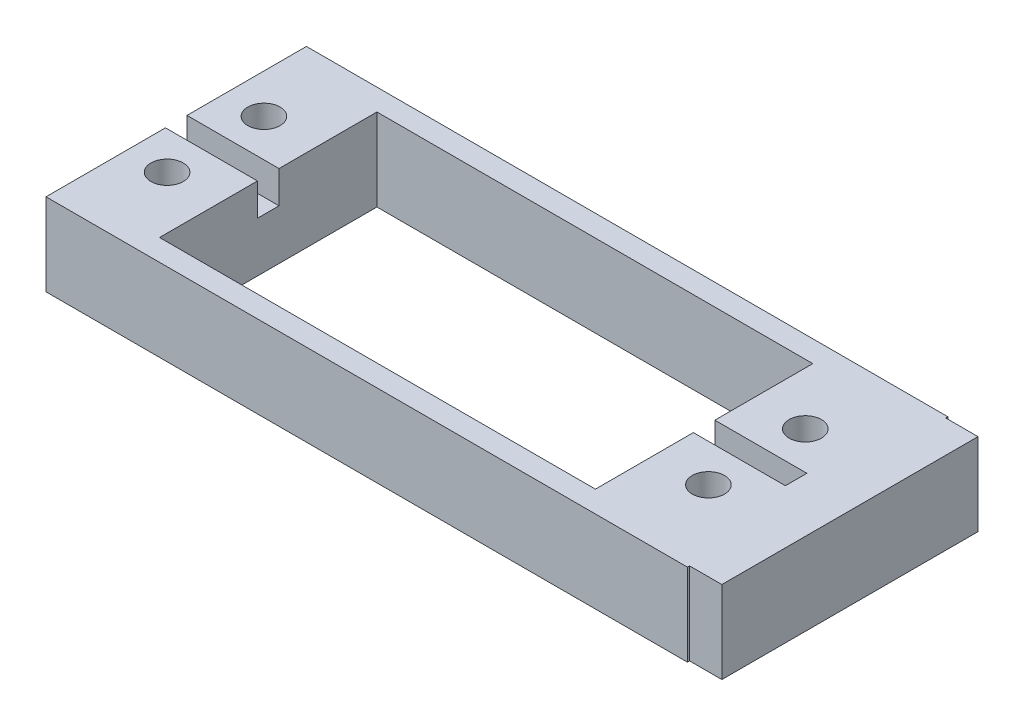
ISO-10303-21;
HEADER;
FILE_DESCRIPTION(('STEP AP214'),'2;1');
FILE_NAME('part.step','',(''),(''),'','','');
FILE_SCHEMA(('AUTOMOTIVE_DESIGN { 1 0 10303 214 1 1 1 1 }'));
ENDSEC;
DATA;
#1=APPLICATION_CONTEXT('core data for automotive mechanical design processes');
#2=APPLICATION_PROTOCOL_DEFINITION('international standard','automotive_design',2000,#1);
#3=PRODUCT_CONTEXT('',#1,'mechanical');
#4=PRODUCT('Part','Part','',(#3));
#5=PRODUCT_RELATED_PRODUCT_CATEGORY('part','',(#4));
#6=PRODUCT_DEFINITION_FORMATION('','',#4);
#7=PRODUCT_DEFINITION_CONTEXT('part definition',#1,'design');
#8=PRODUCT_DEFINITION('design','',#6,#7);
#9=PRODUCT_DEFINITION_SHAPE('','',#8);
#10=(LENGTH_UNIT() NAMED_UNIT(*) SI_UNIT(.MILLI.,.METRE.));
#11=(NAMED_UNIT(*) PLANE_ANGLE_UNIT() SI_UNIT($,.RADIAN.));
#12=(NAMED_UNIT(*) SI_UNIT($,.STERADIAN.) SOLID_ANGLE_UNIT());
#13=UNCERTAINTY_MEASURE_WITH_UNIT(LENGTH_MEASURE(1.E-05),#10,'distance_accuracy_value','');
#14=(GEOMETRIC_REPRESENTATION_CONTEXT(3) GLOBAL_UNCERTAINTY_ASSIGNED_CONTEXT((#13)) GLOBAL_UNIT_ASSIGNED_CONTEXT((#10,
#11,#12)) REPRESENTATION_CONTEXT('',''));
#15=CARTESIAN_POINT('',(0.,0.,0.));
#16=DIRECTION('',(0.,0.,1.));
#17=DIRECTION('',(1.,0.,0.));
#18=AXIS2_PLACEMENT_3D('',#15,#16,#17);
#19=CARTESIAN_POINT('',(-41.2127618521587,0.,0.));
#20=DIRECTION('',(1.,0.,0.));
#21=DIRECTION('',(0.,0.,-1.));
#22=AXIS2_PLACEMENT_3D('',#19,#20,#21);
#23=PLANE('',#22);
#24=DIRECTION('',(0.,1.,0.));
#25=VECTOR('',#24,1.);
#26=CARTESIAN_POINT('',(-41.2127618521587,0.,-3.56654883549664));
#27=LINE('',#26,#25);
#28=CARTESIAN_POINT('',(-41.2127618521587,0.150000000000001,-3.56654883549664));
#29=VERTEX_POINT('',#28);
#30=CARTESIAN_POINT('',(-41.2127618521587,7.8,-3.56654883549664));
#31=VERTEX_POINT('',#30);
#32=EDGE_CURVE('E12',#29,#31,#27,.T.);
#33=ORIENTED_EDGE('',*,*,#32,.F.);
#34=DIRECTION('',(0.,0.,1.));
#35=VECTOR('',#34,1.);
#36=CARTESIAN_POINT('',(-41.2127618521587,0.15,-27.3665488354966));
#37=LINE('',#36,#35);
#38=CARTESIAN_POINT('',(-41.2127618521587,0.15,-27.3665488354966));
#39=VERTEX_POINT('',#38);
#40=EDGE_CURVE('E78',#39,#29,#37,.T.);
#41=ORIENTED_EDGE('',*,*,#40,.F.);
#42=DIRECTION('',(0.,1.,0.));
#43=VECTOR('',#42,1.);
#44=CARTESIAN_POINT('',(-41.2127618521587,0.,-27.3665488354966));
#45=LINE('',#44,#43);
#46=CARTESIAN_POINT('',(-41.2127618521587,7.8,-27.3665488354966));
#47=VERTEX_POINT('',#46);
#48=EDGE_CURVE('E63',#39,#47,#45,.T.);
#49=ORIENTED_EDGE('',*,*,#48,.T.);
#50=DIRECTION('',(0.,0.,1.));
#51=VECTOR('',#50,1.);
#52=CARTESIAN_POINT('',(-41.2127618521587,7.8,-3.36654883549664));
#53=LINE('',#52,#51);
#54=EDGE_CURVE('E240',#47,#31,#53,.T.);
#55=ORIENTED_EDGE('',*,*,#54,.T.);
#56=EDGE_LOOP('',(#33,#41,#49,#55));
#57=FACE_BOUND('',#56,.T.);
#58=ADVANCED_FACE('F54',(#57),#23,.T.);
#59=CARTESIAN_POINT('',(-54.7627618521587,7.8,0.));
#60=DIRECTION('',(1.,0.,0.));
#61=DIRECTION('',(0.,0.,-1.));
#62=AXIS2_PLACEMENT_3D('',#59,#60,#61);
#63=PLANE('',#62);
#64=DIRECTION('',(0.,0.,-1.));
#65=VECTOR('',#64,1.);
#66=CARTESIAN_POINT('',(-54.7627618521587,0.15,0.));
#67=LINE('',#66,#65);
#68=CARTESIAN_POINT('',(-54.7627618521587,0.15,-5.36654883549664));
#69=VERTEX_POINT('',#68);
#70=CARTESIAN_POINT('',(-54.7627618521587,0.15,-25.5665488354966));
#71=VERTEX_POINT('',#70);
#72=EDGE_CURVE('E421',#69,#71,#67,.T.);
#73=ORIENTED_EDGE('',*,*,#72,.F.);
#74=DIRECTION('',(0.,1.,0.));
#75=VECTOR('',#74,1.);
#76=CARTESIAN_POINT('',(-54.7627618521587,0.,-5.36654883549664));
#77=LINE('',#76,#75);
#78=CARTESIAN_POINT('',(-54.7627618521587,7.8,-5.36654883549664));
#79=VERTEX_POINT('',#78);
#80=EDGE_CURVE('E364',#69,#79,#77,.T.);
#81=ORIENTED_EDGE('',*,*,#80,.T.);
#82=DIRECTION('',(0.,0.,1.));
#83=VECTOR('',#82,1.);
#84=CARTESIAN_POINT('',(-54.7627618521587,7.8,0.));
#85=LINE('',#84,#83);
#86=CARTESIAN_POINT('',(-54.7627618521587,7.8,-14.4665488354966));
#87=VERTEX_POINT('',#86);
#88=EDGE_CURVE('E378',#87,#79,#85,.T.);
#89=ORIENTED_EDGE('',*,*,#88,.F.);
#90=DIRECTION('',(0.,1.,0.));
#91=VECTOR('',#90,1.);
#92=CARTESIAN_POINT('',(-54.7627618521587,4.8,-14.4665488354966));
#93=LINE('',#92,#91);
#94=CARTESIAN_POINT('',(-54.7627618521587,4.8,-14.4665488354966));
#95=VERTEX_POINT('',#94);
#96=EDGE_CURVE('E301',#95,#87,#93,.T.);
#97=ORIENTED_EDGE('',*,*,#96,.F.);
#98=DIRECTION('',(0.,0.,1.));
#99=VECTOR('',#98,1.);
#100=CARTESIAN_POINT('',(-54.7627618521587,4.8,0.));
#101=LINE('',#100,#99);
#102=CARTESIAN_POINT('',(-54.7627618521587,4.8,-16.4665488354966));
#103=VERTEX_POINT('',#102);
#104=EDGE_CURVE('E286',#103,#95,#101,.T.);
#105=ORIENTED_EDGE('',*,*,#104,.F.);
#106=DIRECTION('',(0.,1.,0.));
#107=VECTOR('',#106,1.);
#108=CARTESIAN_POINT('',(-54.7627618521587,4.8,-16.4665488354966));
#109=LINE('',#108,#107);
#110=CARTESIAN_POINT('',(-54.7627618521587,7.8,-16.4665488354966));
#111=VERTEX_POINT('',#110);
#112=EDGE_CURVE('E268',#103,#111,#109,.T.);
#113=ORIENTED_EDGE('',*,*,#112,.T.);
#114=CARTESIAN_POINT('',(-54.7627618521587,7.8,-25.5665488354966));
#115=VERTEX_POINT('',#114);
#116=EDGE_CURVE('E379',#115,#111,#85,.T.);
#117=ORIENTED_EDGE('',*,*,#116,.F.);
#118=DIRECTION('',(0.,1.,0.));
#119=VECTOR('',#118,1.);
#120=CARTESIAN_POINT('',(-54.7627618521587,0.,-25.5665488354966));
#121=LINE('',#120,#119);
#122=EDGE_CURVE('E367',#71,#115,#121,.T.);
#123=ORIENTED_EDGE('',*,*,#122,.F.);
#124=EDGE_LOOP('',(#73,#81,#89,#97,#105,#113,#117,#123));
#125=FACE_BOUND('',#124,.T.);
#126=ADVANCED_FACE('F472',(#125),#63,.F.);
#127=CARTESIAN_POINT('',(-103.812761852159,0.,-25.5665488354966));
#128=DIRECTION('',(-1.,0.,0.));
#129=DIRECTION('',(0.,0.,1.));
#130=AXIS2_PLACEMENT_3D('',#127,#128,#129);
#131=PLANE('',#130);
#132=DIRECTION('',(0.,1.,0.));
#133=VECTOR('',#132,1.);
#134=CARTESIAN_POINT('',(-103.812761852159,0.,-27.5665488354966));
#135=LINE('',#134,#133);
#136=CARTESIAN_POINT('',(-103.812761852159,0.15,-27.5665488354966));
#137=VERTEX_POINT('',#136);
#138=CARTESIAN_POINT('',(-103.812761852159,7.8,-27.5665488354966));
#139=VERTEX_POINT('',#138);
#140=EDGE_CURVE('E361',#137,#139,#135,.T.);
#141=ORIENTED_EDGE('',*,*,#140,.F.);
#142=DIRECTION('',(0.,0.,-1.));
#143=VECTOR('',#142,1.);
#144=CARTESIAN_POINT('',(-103.812761852159,0.15,-3.36654883549664));
#145=LINE('',#144,#143);
#146=CARTESIAN_POINT('',(-103.812761852159,0.15,-3.36654883549664));
#147=VERTEX_POINT('',#146);
#148=EDGE_CURVE('E402',#147,#137,#145,.T.);
#149=ORIENTED_EDGE('',*,*,#148,.F.);
#150=DIRECTION('',(0.,1.,0.));
#151=VECTOR('',#150,1.);
#152=CARTESIAN_POINT('',(-103.812761852159,0.,-3.36654883549664));
#153=LINE('',#152,#151);
#154=CARTESIAN_POINT('',(-103.812761852159,7.8,-3.36654883549664));
#155=VERTEX_POINT('',#154);
#156=EDGE_CURVE('E276',#147,#155,#153,.T.);
#157=ORIENTED_EDGE('',*,*,#156,.T.);
#158=DIRECTION('',(0.,0.,1.));
#159=VECTOR('',#158,1.);
#160=CARTESIAN_POINT('',(-103.812761852159,7.8,-25.5665488354966));
#161=LINE('',#160,#159);
#162=CARTESIAN_POINT('',(-103.812761852159,7.8,-14.4665488354966));
#163=VERTEX_POINT('',#162);
#164=EDGE_CURVE('E348',#163,#155,#161,.T.);
#165=ORIENTED_EDGE('',*,*,#164,.F.);
#166=DIRECTION('',(0.,1.,0.));
#167=VECTOR('',#166,1.);
#168=CARTESIAN_POINT('',(-103.812761852159,4.8,-14.4665488354966));
#169=LINE('',#168,#167);
#170=CARTESIAN_POINT('',(-103.812761852159,4.8,-14.4665488354966));
#171=VERTEX_POINT('',#170);
#172=EDGE_CURVE('E277',#171,#163,#169,.T.);
#173=ORIENTED_EDGE('',*,*,#172,.F.);
#174=DIRECTION('',(0.,0.,1.));
#175=VECTOR('',#174,1.);
#176=CARTESIAN_POINT('',(-103.812761852159,4.8,0.));
#177=LINE('',#176,#175);
#178=CARTESIAN_POINT('',(-103.812761852159,4.8,-16.4665488354966));
#179=VERTEX_POINT('',#178);
#180=EDGE_CURVE('E257',#179,#171,#177,.T.);
#181=ORIENTED_EDGE('',*,*,#180,.F.);
#182=DIRECTION('',(0.,1.,0.));
#183=VECTOR('',#182,1.);
#184=CARTESIAN_POINT('',(-103.812761852159,4.8,-16.4665488354966));
#185=LINE('',#184,#183);
#186=CARTESIAN_POINT('',(-103.812761852159,7.8,-16.4665488354966));
#187=VERTEX_POINT('',#186);
#188=EDGE_CURVE('E280',#179,#187,#185,.T.);
#189=ORIENTED_EDGE('',*,*,#188,.T.);
#190=EDGE_CURVE('E349',#139,#187,#161,.T.);
#191=ORIENTED_EDGE('',*,*,#190,.F.);
#192=EDGE_LOOP('',(#141,#149,#157,#165,#173,#181,#189,#191));
#193=FACE_BOUND('',#192,.T.);
#194=ADVANCED_FACE('F478',(#193),#131,.T.);
#195=CARTESIAN_POINT('',(-95.2627618521587,7.8,0.));
#196=DIRECTION('',(1.,0.,0.));
#197=DIRECTION('',(0.,0.,-1.));
#198=AXIS2_PLACEMENT_3D('',#195,#196,#197);
#199=PLANE('',#198);
#200=DIRECTION('',(0.,1.,0.));
#201=VECTOR('',#200,1.);
#202=CARTESIAN_POINT('',(-95.2627618521587,0.,-5.36654883549664));
#203=LINE('',#202,#201);
#204=CARTESIAN_POINT('',(-95.2627618521587,0.15,-5.36654883549664));
#205=VERTEX_POINT('',#204);
#206=CARTESIAN_POINT('',(-95.2627618521587,7.8,-5.36654883549664));
#207=VERTEX_POINT('',#206);
#208=EDGE_CURVE('E332',#205,#207,#203,.T.);
#209=ORIENTED_EDGE('',*,*,#208,.F.);
#210=DIRECTION('',(0.,0.,-1.));
#211=VECTOR('',#210,1.);
#212=CARTESIAN_POINT('',(-95.2627618521587,0.15,0.));
#213=LINE('',#212,#211);
#214=CARTESIAN_POINT('',(-95.2627618521587,0.15,-25.5665488354966));
#215=VERTEX_POINT('',#214);
#216=EDGE_CURVE('E70',#205,#215,#213,.T.);
#217=ORIENTED_EDGE('',*,*,#216,.T.);
#218=DIRECTION('',(0.,1.,0.));
#219=VECTOR('',#218,1.);
#220=CARTESIAN_POINT('',(-95.2627618521587,0.,-25.5665488354966));
#221=LINE('',#220,#219);
#222=CARTESIAN_POINT('',(-95.2627618521587,7.8,-25.5665488354966));
#223=VERTEX_POINT('',#222);
#224=EDGE_CURVE('E329',#215,#223,#221,.T.);
#225=ORIENTED_EDGE('',*,*,#224,.T.);
#226=DIRECTION('',(0.,0.,1.));
#227=VECTOR('',#226,1.);
#228=CARTESIAN_POINT('',(-95.2627618521587,7.8,0.));
#229=LINE('',#228,#227);
#230=CARTESIAN_POINT('',(-95.2627618521587,7.8,-16.4665488354966));
#231=VERTEX_POINT('',#230);
#232=EDGE_CURVE('E344',#223,#231,#229,.T.);
#233=ORIENTED_EDGE('',*,*,#232,.T.);
#234=DIRECTION('',(0.,1.,0.));
#235=VECTOR('',#234,1.);
#236=CARTESIAN_POINT('',(-95.2627618521587,4.8,-16.4665488354966));
#237=LINE('',#236,#235);
#238=CARTESIAN_POINT('',(-95.2627618521587,4.8,-16.4665488354966));
#239=VERTEX_POINT('',#238);
#240=EDGE_CURVE('E264',#239,#231,#237,.T.);
#241=ORIENTED_EDGE('',*,*,#240,.F.);
#242=DIRECTION('',(0.,0.,-1.));
#243=VECTOR('',#242,1.);
#244=CARTESIAN_POINT('',(-95.2627618521587,4.8,0.));
#245=LINE('',#244,#243);
#246=CARTESIAN_POINT('',(-95.2627618521587,4.8,-14.4665488354966));
#247=VERTEX_POINT('',#246);
#248=EDGE_CURVE('E248',#247,#239,#245,.T.);
#249=ORIENTED_EDGE('',*,*,#248,.F.);
#250=DIRECTION('',(0.,1.,0.));
#251=VECTOR('',#250,1.);
#252=CARTESIAN_POINT('',(-95.2627618521587,4.8,-14.4665488354966));
#253=LINE('',#252,#251);
#254=CARTESIAN_POINT('',(-95.2627618521587,7.8,-14.4665488354966));
#255=VERTEX_POINT('',#254);
#256=EDGE_CURVE('E272',#247,#255,#253,.T.);
#257=ORIENTED_EDGE('',*,*,#256,.T.);
#258=EDGE_CURVE('E343',#255,#207,#229,.T.);
#259=ORIENTED_EDGE('',*,*,#258,.T.);
#260=EDGE_LOOP('',(#209,#217,#225,#233,#241,#249,#257,#259));
#261=FACE_BOUND('',#260,.T.);
#262=ADVANCED_FACE('F513',(#261),#199,.T.);
#263=CARTESIAN_POINT('',(-49.8627618521587,7.8,-19.9665488354966));
#264=DIRECTION('',(0.,-1.,0.));
#265=DIRECTION('',(0.,0.,-1.));
#266=AXIS2_PLACEMENT_3D('',#263,#264,#265);
#267=CYLINDRICAL_SURFACE('',#266,1.5);
#268=CARTESIAN_POINT('',(-49.8627618521587,7.8,-19.9665488354966));
#269=DIRECTION('',(0.,1.,0.));
#270=DIRECTION('',(0.,0.,1.));
#271=AXIS2_PLACEMENT_3D('',#268,#269,#270);
#272=CIRCLE('',#271,1.5);
#273=CARTESIAN_POINT('',(-49.8627618521587,7.8,-18.4665488354966));
#274=VERTEX_POINT('',#273);
#275=EDGE_CURVE('E374',#274,#274,#272,.T.);
#276=ORIENTED_EDGE('',*,*,#275,.T.);
#277=EDGE_LOOP('',(#276));
#278=FACE_BOUND('',#277,.T.);
#279=CARTESIAN_POINT('',(-49.8627618521587,0.15,-19.9665488354966));
#280=DIRECTION('',(0.,-1.,0.));
#281=DIRECTION('',(0.,0.,-1.));
#282=AXIS2_PLACEMENT_3D('',#279,#280,#281);
#283=CIRCLE('',#282,1.5);
#284=CARTESIAN_POINT('',(-49.8627618521587,0.15,-21.4665488354966));
#285=VERTEX_POINT('',#284);
#286=EDGE_CURVE('E227',#285,#285,#283,.T.);
#287=ORIENTED_EDGE('',*,*,#286,.T.);
#288=EDGE_LOOP('',(#287));
#289=FACE_BOUND('',#288,.T.);
#290=ADVANCED_FACE('F443',(#278,#289),#267,.F.);
#291=CARTESIAN_POINT('',(-49.8627618521587,7.8,-10.9665488354966));
#292=DIRECTION('',(0.,-1.,0.));
#293=DIRECTION('',(0.,0.,-1.));
#294=AXIS2_PLACEMENT_3D('',#291,#292,#293);
#295=CYLINDRICAL_SURFACE('',#294,1.5);
#296=CARTESIAN_POINT('',(-49.8627618521587,7.8,-10.9665488354966));
#297=DIRECTION('',(0.,1.,0.));
#298=DIRECTION('',(0.,0.,1.));
#299=AXIS2_PLACEMENT_3D('',#296,#297,#298);
#300=CIRCLE('',#299,1.5);
#301=CARTESIAN_POINT('',(-49.8627618521587,7.8,-9.46654883549664));
#302=VERTEX_POINT('',#301);
#303=EDGE_CURVE('E370',#302,#302,#300,.T.);
#304=ORIENTED_EDGE('',*,*,#303,.T.);
#305=EDGE_LOOP('',(#304));
#306=FACE_BOUND('',#305,.T.);
#307=CARTESIAN_POINT('',(-49.8627618521587,0.15,-10.9665488354966));
#308=DIRECTION('',(0.,-1.,0.));
#309=DIRECTION('',(0.,0.,-1.));
#310=AXIS2_PLACEMENT_3D('',#307,#308,#309);
#311=CIRCLE('',#310,1.5);
#312=CARTESIAN_POINT('',(-49.8627618521587,0.15,-12.4665488354967));
#313=VERTEX_POINT('',#312);
#314=EDGE_CURVE('E436',#313,#313,#311,.T.);
#315=ORIENTED_EDGE('',*,*,#314,.T.);
#316=EDGE_LOOP('',(#315));
#317=FACE_BOUND('',#316,.T.);
#318=ADVANCED_FACE('F56',(#306,#317),#295,.F.);
#319=CARTESIAN_POINT('',(-103.812761852159,0.,-27.5665488354966));
#320=DIRECTION('',(0.,0.,-1.));
#321=DIRECTION('',(-1.,0.,0.));
#322=AXIS2_PLACEMENT_3D('',#319,#320,#321);
#323=PLANE('',#322);
#324=DIRECTION('',(0.,-1.,0.));
#325=VECTOR('',#324,1.);
#326=CARTESIAN_POINT('',(-44.2127618521587,13.8,-27.5665488354966));
#327=LINE('',#326,#325);
#328=CARTESIAN_POINT('',(-44.2127618521587,7.8,-27.5665488354966));
#329=VERTEX_POINT('',#328);
#330=CARTESIAN_POINT('',(-44.2127618521587,0.15,-27.5665488354966));
#331=VERTEX_POINT('',#330);
#332=EDGE_CURVE('E213',#329,#331,#327,.T.);
#333=ORIENTED_EDGE('',*,*,#332,.T.);
#334=DIRECTION('',(1.,0.,0.));
#335=VECTOR('',#334,1.);
#336=CARTESIAN_POINT('',(-103.812761852159,0.15,-27.5665488354966));
#337=LINE('',#336,#335);
#338=EDGE_CURVE('E405',#137,#331,#337,.T.);
#339=ORIENTED_EDGE('',*,*,#338,.F.);
#340=ORIENTED_EDGE('',*,*,#140,.T.);
#341=DIRECTION('',(-1.,0.,0.));
#342=VECTOR('',#341,1.);
#343=CARTESIAN_POINT('',(-103.812761852159,7.8,-27.5665488354966));
#344=LINE('',#343,#342);
#345=EDGE_CURVE('E357',#329,#139,#344,.T.);
#346=ORIENTED_EDGE('',*,*,#345,.F.);
#347=EDGE_LOOP('',(#333,#339,#340,#346));
#348=FACE_BOUND('',#347,.T.);
#349=ADVANCED_FACE('F560',(#348),#323,.T.);
#350=CARTESIAN_POINT('',(-103.812761852159,0.,-25.5665488354966));
#351=DIRECTION('',(0.,0.,1.));
#352=DIRECTION('',(1.,0.,0.));
#353=AXIS2_PLACEMENT_3D('',#350,#351,#352);
#354=PLANE('',#353);
#355=ORIENTED_EDGE('',*,*,#224,.F.);
#356=DIRECTION('',(1.,0.,0.));
#357=VECTOR('',#356,1.);
#358=CARTESIAN_POINT('',(-103.812761852159,0.15,-25.5665488354966));
#359=LINE('',#358,#357);
#360=EDGE_CURVE('E424',#215,#71,#359,.T.);
#361=ORIENTED_EDGE('',*,*,#360,.T.);
#362=ORIENTED_EDGE('',*,*,#122,.T.);
#363=DIRECTION('',(1.,0.,0.));
#364=VECTOR('',#363,1.);
#365=CARTESIAN_POINT('',(-103.812761852159,7.8,-25.5665488354966));
#366=LINE('',#365,#364);
#367=EDGE_CURVE('E353',#223,#115,#366,.T.);
#368=ORIENTED_EDGE('',*,*,#367,.F.);
#369=EDGE_LOOP('',(#355,#361,#362,#368));
#370=FACE_BOUND('',#369,.T.);
#371=ADVANCED_FACE('F467',(#370),#354,.T.);
#372=CARTESIAN_POINT('',(-100.162761852159,7.8,-19.9665488354966));
#373=DIRECTION('',(0.,-1.,0.));
#374=DIRECTION('',(0.,0.,-1.));
#375=AXIS2_PLACEMENT_3D('',#372,#373,#374);
#376=CYLINDRICAL_SURFACE('',#375,1.5);
#377=CARTESIAN_POINT('',(-100.162761852159,7.8,-19.9665488354966));
#378=DIRECTION('',(0.,1.,0.));
#379=DIRECTION('',(0.,0.,1.));
#380=AXIS2_PLACEMENT_3D('',#377,#378,#379);
#381=CIRCLE('',#380,1.5);
#382=CARTESIAN_POINT('',(-100.162761852159,7.8,-18.4665488354966));
#383=VERTEX_POINT('',#382);
#384=EDGE_CURVE('E339',#383,#383,#381,.T.);
#385=ORIENTED_EDGE('',*,*,#384,.T.);
#386=EDGE_LOOP('',(#385));
#387=FACE_BOUND('',#386,.T.);
#388=CARTESIAN_POINT('',(-100.162761852159,0.15,-19.9665488354966));
#389=DIRECTION('',(0.,-1.,0.));
#390=DIRECTION('',(0.,0.,-1.));
#391=AXIS2_PLACEMENT_3D('',#388,#389,#390);
#392=CIRCLE('',#391,1.5);
#393=CARTESIAN_POINT('',(-100.162761852159,0.15,-21.4665488354966));
#394=VERTEX_POINT('',#393);
#395=EDGE_CURVE('E432',#394,#394,#392,.T.);
#396=ORIENTED_EDGE('',*,*,#395,.T.);
#397=EDGE_LOOP('',(#396));
#398=FACE_BOUND('',#397,.T.);
#399=ADVANCED_FACE('F458',(#387,#398),#376,.F.);
#400=CARTESIAN_POINT('',(-100.162761852159,7.8,-10.9665488354966));
#401=DIRECTION('',(0.,-1.,0.));
#402=DIRECTION('',(0.,0.,-1.));
#403=AXIS2_PLACEMENT_3D('',#400,#401,#402);
#404=CYLINDRICAL_SURFACE('',#403,1.5);
#405=CARTESIAN_POINT('',(-100.162761852159,7.8,-10.9665488354966));
#406=DIRECTION('',(0.,1.,0.));
#407=DIRECTION('',(0.,0.,1.));
#408=AXIS2_PLACEMENT_3D('',#405,#406,#407);
#409=CIRCLE('',#408,1.5);
#410=CARTESIAN_POINT('',(-100.162761852159,7.8,-9.46654883549665));
#411=VERTEX_POINT('',#410);
#412=EDGE_CURVE('E335',#411,#411,#409,.T.);
#413=ORIENTED_EDGE('',*,*,#412,.T.);
#414=EDGE_LOOP('',(#413));
#415=FACE_BOUND('',#414,.T.);
#416=CARTESIAN_POINT('',(-100.162761852159,0.15,-10.9665488354966));
#417=DIRECTION('',(0.,-1.,0.));
#418=DIRECTION('',(0.,0.,-1.));
#419=AXIS2_PLACEMENT_3D('',#416,#417,#418);
#420=CIRCLE('',#419,1.5);
#421=CARTESIAN_POINT('',(-100.162761852159,0.15,-12.4665488354966));
#422=VERTEX_POINT('',#421);
#423=EDGE_CURVE('E428',#422,#422,#420,.T.);
#424=ORIENTED_EDGE('',*,*,#423,.T.);
#425=EDGE_LOOP('',(#424));
#426=FACE_BOUND('',#425,.T.);
#427=ADVANCED_FACE('F455',(#415,#426),#404,.F.);
#428=CARTESIAN_POINT('',(-103.812761852159,0.,-5.36654883549664));
#429=DIRECTION('',(0.,0.,-1.));
#430=DIRECTION('',(-1.,0.,0.));
#431=AXIS2_PLACEMENT_3D('',#428,#429,#430);
#432=PLANE('',#431);
#433=ORIENTED_EDGE('',*,*,#80,.F.);
#434=DIRECTION('',(-1.,0.,0.));
#435=VECTOR('',#434,1.);
#436=CARTESIAN_POINT('',(-103.812761852159,0.15,-5.36654883549664));
#437=LINE('',#436,#435);
#438=EDGE_CURVE('E416',#69,#205,#437,.T.);
#439=ORIENTED_EDGE('',*,*,#438,.T.);
#440=ORIENTED_EDGE('',*,*,#208,.T.);
#441=DIRECTION('',(-1.,0.,0.));
#442=VECTOR('',#441,1.);
#443=CARTESIAN_POINT('',(-103.812761852159,7.8,-5.36654883549664));
#444=LINE('',#443,#442);
#445=EDGE_CURVE('E321',#79,#207,#444,.T.);
#446=ORIENTED_EDGE('',*,*,#445,.F.);
#447=EDGE_LOOP('',(#433,#439,#440,#446));
#448=FACE_BOUND('',#447,.T.);
#449=ADVANCED_FACE('F457',(#448),#432,.T.);
#450=CARTESIAN_POINT('',(-103.812761852159,0.,-3.36654883549664));
#451=DIRECTION('',(0.,0.,1.));
#452=DIRECTION('',(1.,0.,0.));
#453=AXIS2_PLACEMENT_3D('',#450,#451,#452);
#454=PLANE('',#453);
#455=ORIENTED_EDGE('',*,*,#156,.F.);
#456=DIRECTION('',(-1.,0.,0.));
#457=VECTOR('',#456,1.);
#458=CARTESIAN_POINT('',(-44.2127618521587,0.15,-3.36654883549664));
#459=LINE('',#458,#457);
#460=CARTESIAN_POINT('',(-44.2127618521587,0.15,-3.36654883549664));
#461=VERTEX_POINT('',#460);
#462=EDGE_CURVE('E207',#461,#147,#459,.T.);
#463=ORIENTED_EDGE('',*,*,#462,.F.);
#464=DIRECTION('',(0.,-1.,0.));
#465=VECTOR('',#464,1.);
#466=CARTESIAN_POINT('',(-44.2127618521587,13.8,-3.36654883549664));
#467=LINE('',#466,#465);
#468=CARTESIAN_POINT('',(-44.2127618521587,7.8,-3.36654883549664));
#469=VERTEX_POINT('',#468);
#470=EDGE_CURVE('E205',#469,#461,#467,.T.);
#471=ORIENTED_EDGE('',*,*,#470,.F.);
#472=DIRECTION('',(1.,0.,0.));
#473=VECTOR('',#472,1.);
#474=CARTESIAN_POINT('',(-103.812761852159,7.8,-3.36654883549664));
#475=LINE('',#474,#473);
#476=EDGE_CURVE('E325',#155,#469,#475,.T.);
#477=ORIENTED_EDGE('',*,*,#476,.F.);
#478=EDGE_LOOP('',(#455,#463,#471,#477));
#479=FACE_BOUND('',#478,.T.);
#480=ADVANCED_FACE('F399',(#479),#454,.T.);
#481=CARTESIAN_POINT('',(0.,13.8,-27.3665488354966));
#482=DIRECTION('',(0.,0.,-1.));
#483=DIRECTION('',(-1.,0.,0.));
#484=AXIS2_PLACEMENT_3D('',#481,#482,#483);
#485=PLANE('',#484);
#486=ORIENTED_EDGE('',*,*,#48,.F.);
#487=DIRECTION('',(1.,0.,0.));
#488=VECTOR('',#487,1.);
#489=CARTESIAN_POINT('',(-44.2127618521587,0.15,-27.3665488354966));
#490=LINE('',#489,#488);
#491=CARTESIAN_POINT('',(-44.2127618521587,0.15,-27.3665488354966));
#492=VERTEX_POINT('',#491);
#493=EDGE_CURVE('E413',#492,#39,#490,.T.);
#494=ORIENTED_EDGE('',*,*,#493,.F.);
#495=DIRECTION('',(0.,-1.,0.));
#496=VECTOR('',#495,1.);
#497=CARTESIAN_POINT('',(-44.2127618521587,13.8,-27.3665488354966));
#498=LINE('',#497,#496);
#499=CARTESIAN_POINT('',(-44.2127618521587,7.8,-27.3665488354966));
#500=VERTEX_POINT('',#499);
#501=EDGE_CURVE('E220',#500,#492,#498,.T.);
#502=ORIENTED_EDGE('',*,*,#501,.F.);
#503=DIRECTION('',(-1.,0.,0.));
#504=VECTOR('',#503,1.);
#505=CARTESIAN_POINT('',(0.,7.8,-27.3665488354966));
#506=LINE('',#505,#504);
#507=EDGE_CURVE('E217',#47,#500,#506,.T.);
#508=ORIENTED_EDGE('',*,*,#507,.F.);
#509=EDGE_LOOP('',(#486,#494,#502,#508));
#510=FACE_BOUND('',#509,.T.);
#511=ADVANCED_FACE('F390',(#510),#485,.T.);
#512=CARTESIAN_POINT('',(-44.2127618521587,13.8,0.));
#513=DIRECTION('',(-1.,0.,0.));
#514=DIRECTION('',(0.,0.,1.));
#515=AXIS2_PLACEMENT_3D('',#512,#513,#514);
#516=PLANE('',#515);
#517=DIRECTION('',(0.,0.,1.));
#518=VECTOR('',#517,1.);
#519=CARTESIAN_POINT('',(-44.2127618521587,0.15,-27.5665488354966));
#520=LINE('',#519,#518);
#521=EDGE_CURVE('E410',#331,#492,#520,.T.);
#522=ORIENTED_EDGE('',*,*,#521,.F.);
#523=ORIENTED_EDGE('',*,*,#332,.F.);
#524=DIRECTION('',(0.,0.,1.));
#525=VECTOR('',#524,1.);
#526=CARTESIAN_POINT('',(-44.2127618521587,7.8,0.));
#527=LINE('',#526,#525);
#528=EDGE_CURVE('E236',#329,#500,#527,.T.);
#529=ORIENTED_EDGE('',*,*,#528,.T.);
#530=ORIENTED_EDGE('',*,*,#501,.T.);
#531=EDGE_LOOP('',(#522,#523,#529,#530));
#532=FACE_BOUND('',#531,.T.);
#533=ADVANCED_FACE('F563',(#532),#516,.F.);
#534=CARTESIAN_POINT('',(-44.2127618521587,13.8,0.));
#535=DIRECTION('',(-1.,0.,0.));
#536=DIRECTION('',(0.,0.,1.));
#537=AXIS2_PLACEMENT_3D('',#534,#535,#536);
#538=PLANE('',#537);
#539=DIRECTION('',(0.,0.,1.));
#540=VECTOR('',#539,1.);
#541=CARTESIAN_POINT('',(-44.2127618521587,0.15,-3.56654883549664));
#542=LINE('',#541,#540);
#543=CARTESIAN_POINT('',(-44.2127618521587,0.15,-3.56654883549664));
#544=VERTEX_POINT('',#543);
#545=EDGE_CURVE('E191',#544,#461,#542,.T.);
#546=ORIENTED_EDGE('',*,*,#545,.F.);
#547=DIRECTION('',(0.,-1.,0.));
#548=VECTOR('',#547,1.);
#549=CARTESIAN_POINT('',(-44.2127618521587,13.8,-3.56654883549664));
#550=LINE('',#549,#548);
#551=CARTESIAN_POINT('',(-44.2127618521587,7.8,-3.56654883549664));
#552=VERTEX_POINT('',#551);
#553=EDGE_CURVE('E202',#552,#544,#550,.T.);
#554=ORIENTED_EDGE('',*,*,#553,.F.);
#555=DIRECTION('',(0.,0.,1.));
#556=VECTOR('',#555,1.);
#557=CARTESIAN_POINT('',(-44.2127618521587,7.8,0.));
#558=LINE('',#557,#556);
#559=EDGE_CURVE('E233',#552,#469,#558,.T.);
#560=ORIENTED_EDGE('',*,*,#559,.T.);
#561=ORIENTED_EDGE('',*,*,#470,.T.);
#562=EDGE_LOOP('',(#546,#554,#560,#561));
#563=FACE_BOUND('',#562,.T.);
#564=ADVANCED_FACE('F201',(#563),#538,.F.);
#565=CARTESIAN_POINT('',(0.,13.8,-3.56654883549664));
#566=DIRECTION('',(0.,0.,-1.));
#567=DIRECTION('',(-1.,0.,0.));
#568=AXIS2_PLACEMENT_3D('',#565,#566,#567);
#569=PLANE('',#568);
#570=DIRECTION('',(-1.,0.,0.));
#571=VECTOR('',#570,1.);
#572=CARTESIAN_POINT('',(-41.2127618521587,0.15,-3.56654883549664));
#573=LINE('',#572,#571);
#574=EDGE_CURVE('E188',#29,#544,#573,.T.);
#575=ORIENTED_EDGE('',*,*,#574,.F.);
#576=ORIENTED_EDGE('',*,*,#32,.T.);
#577=DIRECTION('',(-1.,0.,0.));
#578=VECTOR('',#577,1.);
#579=CARTESIAN_POINT('',(0.,7.8,-3.56654883549664));
#580=LINE('',#579,#578);
#581=EDGE_CURVE('E211',#31,#552,#580,.T.);
#582=ORIENTED_EDGE('',*,*,#581,.T.);
#583=ORIENTED_EDGE('',*,*,#553,.T.);
#584=EDGE_LOOP('',(#575,#576,#582,#583));
#585=FACE_BOUND('',#584,.T.);
#586=ADVANCED_FACE('F209',(#585),#569,.F.);
#587=CARTESIAN_POINT('',(0.,7.8,0.));
#588=DIRECTION('',(0.,1.,0.));
#589=DIRECTION('',(0.,0.,1.));
#590=AXIS2_PLACEMENT_3D('',#587,#588,#589);
#591=PLANE('',#590);
#592=ORIENTED_EDGE('',*,*,#559,.F.);
#593=ORIENTED_EDGE('',*,*,#581,.F.);
#594=ORIENTED_EDGE('',*,*,#54,.F.);
#595=ORIENTED_EDGE('',*,*,#507,.T.);
#596=ORIENTED_EDGE('',*,*,#528,.F.);
#597=ORIENTED_EDGE('',*,*,#345,.T.);
#598=ORIENTED_EDGE('',*,*,#190,.T.);
#599=DIRECTION('',(-1.,0.,0.));
#600=VECTOR('',#599,1.);
#601=CARTESIAN_POINT('',(0.,7.8,-16.4665488354966));
#602=LINE('',#601,#600);
#603=EDGE_CURVE('E265',#231,#187,#602,.T.);
#604=ORIENTED_EDGE('',*,*,#603,.F.);
#605=ORIENTED_EDGE('',*,*,#232,.F.);
#606=ORIENTED_EDGE('',*,*,#367,.T.);
#607=ORIENTED_EDGE('',*,*,#116,.T.);
#608=DIRECTION('',(1.,0.,0.));
#609=VECTOR('',#608,1.);
#610=CARTESIAN_POINT('',(0.,7.8,-16.4665488354966));
#611=LINE('',#610,#609);
#612=CARTESIAN_POINT('',(-46.2127618521587,7.8,-16.4665488354966));
#613=VERTEX_POINT('',#612);
#614=EDGE_CURVE('E291',#111,#613,#611,.T.);
#615=ORIENTED_EDGE('',*,*,#614,.T.);
#616=DIRECTION('',(0.,0.,1.));
#617=VECTOR('',#616,1.);
#618=CARTESIAN_POINT('',(-46.2127618521587,7.8,-3.36654883549664));
#619=LINE('',#618,#617);
#620=CARTESIAN_POINT('',(-46.2127618521587,7.8,-14.4665488354966));
#621=VERTEX_POINT('',#620);
#622=EDGE_CURVE('E239',#613,#621,#619,.T.);
#623=ORIENTED_EDGE('',*,*,#622,.T.);
#624=DIRECTION('',(1.,0.,0.));
#625=VECTOR('',#624,1.);
#626=CARTESIAN_POINT('',(0.,7.8,-14.4665488354966));
#627=LINE('',#626,#625);
#628=EDGE_CURVE('E244',#87,#621,#627,.T.);
#629=ORIENTED_EDGE('',*,*,#628,.F.);
#630=ORIENTED_EDGE('',*,*,#88,.T.);
#631=ORIENTED_EDGE('',*,*,#445,.T.);
#632=ORIENTED_EDGE('',*,*,#258,.F.);
#633=DIRECTION('',(-1.,0.,0.));
#634=VECTOR('',#633,1.);
#635=CARTESIAN_POINT('',(0.,7.8,-14.4665488354966));
#636=LINE('',#635,#634);
#637=EDGE_CURVE('E253',#255,#163,#636,.T.);
#638=ORIENTED_EDGE('',*,*,#637,.T.);
#639=ORIENTED_EDGE('',*,*,#164,.T.);
#640=ORIENTED_EDGE('',*,*,#476,.T.);
#641=EDGE_LOOP('',(#592,#593,#594,#595,#596,#597,#598,#604,#605,#606,#607,#615,#623,#629,#630,
#631,#632,#638,#639,#640));
#642=FACE_BOUND('',#641,.T.);
#643=ORIENTED_EDGE('',*,*,#275,.F.);
#644=EDGE_LOOP('',(#643));
#645=FACE_BOUND('',#644,.T.);
#646=ORIENTED_EDGE('',*,*,#384,.F.);
#647=EDGE_LOOP('',(#646));
#648=FACE_BOUND('',#647,.T.);
#649=ORIENTED_EDGE('',*,*,#303,.F.);
#650=EDGE_LOOP('',(#649));
#651=FACE_BOUND('',#650,.T.);
#652=ORIENTED_EDGE('',*,*,#412,.F.);
#653=EDGE_LOOP('',(#652));
#654=FACE_BOUND('',#653,.T.);
#655=ADVANCED_FACE('F393',(#642,#645,#648,#651,#654),#591,.T.);
#656=CARTESIAN_POINT('',(0.,4.8,-14.4665488354966));
#657=DIRECTION('',(0.,0.,-1.));
#658=DIRECTION('',(-1.,0.,0.));
#659=AXIS2_PLACEMENT_3D('',#656,#657,#658);
#660=PLANE('',#659);
#661=ORIENTED_EDGE('',*,*,#637,.F.);
#662=ORIENTED_EDGE('',*,*,#256,.F.);
#663=DIRECTION('',(-1.,0.,0.));
#664=VECTOR('',#663,1.);
#665=CARTESIAN_POINT('',(0.,4.8,-14.4665488354966));
#666=LINE('',#665,#664);
#667=EDGE_CURVE('E261',#247,#171,#666,.T.);
#668=ORIENTED_EDGE('',*,*,#667,.T.);
#669=ORIENTED_EDGE('',*,*,#172,.T.);
#670=EDGE_LOOP('',(#661,#662,#668,#669));
#671=FACE_BOUND('',#670,.T.);
#672=ADVANCED_FACE('F494',(#671),#660,.T.);
#673=CARTESIAN_POINT('',(0.,4.8,-16.4665488354966));
#674=DIRECTION('',(0.,0.,-1.));
#675=DIRECTION('',(-1.,0.,0.));
#676=AXIS2_PLACEMENT_3D('',#673,#674,#675);
#677=PLANE('',#676);
#678=ORIENTED_EDGE('',*,*,#603,.T.);
#679=ORIENTED_EDGE('',*,*,#188,.F.);
#680=DIRECTION('',(-1.,0.,0.));
#681=VECTOR('',#680,1.);
#682=CARTESIAN_POINT('',(0.,4.8,-16.4665488354966));
#683=LINE('',#682,#681);
#684=EDGE_CURVE('E252',#239,#179,#683,.T.);
#685=ORIENTED_EDGE('',*,*,#684,.F.);
#686=ORIENTED_EDGE('',*,*,#240,.T.);
#687=EDGE_LOOP('',(#678,#679,#685,#686));
#688=FACE_BOUND('',#687,.T.);
#689=ADVANCED_FACE('F492',(#688),#677,.F.);
#690=CARTESIAN_POINT('',(0.,4.8,0.));
#691=DIRECTION('',(0.,1.,0.));
#692=DIRECTION('',(0.,0.,1.));
#693=AXIS2_PLACEMENT_3D('',#690,#691,#692);
#694=PLANE('',#693);
#695=ORIENTED_EDGE('',*,*,#248,.T.);
#696=ORIENTED_EDGE('',*,*,#684,.T.);
#697=ORIENTED_EDGE('',*,*,#180,.T.);
#698=ORIENTED_EDGE('',*,*,#667,.F.);
#699=EDGE_LOOP('',(#695,#696,#697,#698));
#700=FACE_BOUND('',#699,.T.);
#701=ADVANCED_FACE('F488',(#700),#694,.T.);
#702=CARTESIAN_POINT('',(0.,4.8,-16.4665488354966));
#703=DIRECTION('',(0.,0.,1.));
#704=DIRECTION('',(1.,0.,0.));
#705=AXIS2_PLACEMENT_3D('',#702,#703,#704);
#706=PLANE('',#705);
#707=ORIENTED_EDGE('',*,*,#614,.F.);
#708=ORIENTED_EDGE('',*,*,#112,.F.);
#709=DIRECTION('',(1.,0.,0.));
#710=VECTOR('',#709,1.);
#711=CARTESIAN_POINT('',(0.,4.8,-16.4665488354966));
#712=LINE('',#711,#710);
#713=CARTESIAN_POINT('',(-46.2127618521587,4.8,-16.4665488354966));
#714=VERTEX_POINT('',#713);
#715=EDGE_CURVE('E298',#103,#714,#712,.T.);
#716=ORIENTED_EDGE('',*,*,#715,.T.);
#717=DIRECTION('',(0.,1.,0.));
#718=VECTOR('',#717,1.);
#719=CARTESIAN_POINT('',(-46.2127618521587,4.8,-16.4665488354966));
#720=LINE('',#719,#718);
#721=EDGE_CURVE('E310',#714,#613,#720,.T.);
#722=ORIENTED_EDGE('',*,*,#721,.T.);
#723=EDGE_LOOP('',(#707,#708,#716,#722));
#724=FACE_BOUND('',#723,.T.);
#725=ADVANCED_FACE('F491',(#724),#706,.T.);
#726=CARTESIAN_POINT('',(0.,4.8,-14.4665488354966));
#727=DIRECTION('',(0.,0.,1.));
#728=DIRECTION('',(1.,0.,0.));
#729=AXIS2_PLACEMENT_3D('',#726,#727,#728);
#730=PLANE('',#729);
#731=ORIENTED_EDGE('',*,*,#628,.T.);
#732=DIRECTION('',(0.,1.,0.));
#733=VECTOR('',#732,1.);
#734=CARTESIAN_POINT('',(-46.2127618521587,4.8,-14.4665488354966));
#735=LINE('',#734,#733);
#736=CARTESIAN_POINT('',(-46.2127618521587,4.8,-14.4665488354966));
#737=VERTEX_POINT('',#736);
#738=EDGE_CURVE('E313',#737,#621,#735,.T.);
#739=ORIENTED_EDGE('',*,*,#738,.F.);
#740=DIRECTION('',(1.,0.,0.));
#741=VECTOR('',#740,1.);
#742=CARTESIAN_POINT('',(0.,4.8,-14.4665488354966));
#743=LINE('',#742,#741);
#744=EDGE_CURVE('E290',#95,#737,#743,.T.);
#745=ORIENTED_EDGE('',*,*,#744,.F.);
#746=ORIENTED_EDGE('',*,*,#96,.T.);
#747=EDGE_LOOP('',(#731,#739,#745,#746));
#748=FACE_BOUND('',#747,.T.);
#749=ADVANCED_FACE('F503',(#748),#730,.F.);
#750=CARTESIAN_POINT('',(0.,4.8,0.));
#751=DIRECTION('',(0.,1.,0.));
#752=DIRECTION('',(0.,0.,1.));
#753=AXIS2_PLACEMENT_3D('',#750,#751,#752);
#754=PLANE('',#753);
#755=ORIENTED_EDGE('',*,*,#104,.T.);
#756=ORIENTED_EDGE('',*,*,#744,.T.);
#757=DIRECTION('',(0.,0.,-1.));
#758=VECTOR('',#757,1.);
#759=CARTESIAN_POINT('',(-46.2127618521587,4.8,0.));
#760=LINE('',#759,#758);
#761=EDGE_CURVE('E294',#737,#714,#760,.T.);
#762=ORIENTED_EDGE('',*,*,#761,.T.);
#763=ORIENTED_EDGE('',*,*,#715,.F.);
#764=EDGE_LOOP('',(#755,#756,#762,#763));
#765=FACE_BOUND('',#764,.T.);
#766=ADVANCED_FACE('F486',(#765),#754,.T.);
#767=CARTESIAN_POINT('',(-46.2127618521587,0.,0.));
#768=DIRECTION('',(1.,0.,0.));
#769=DIRECTION('',(0.,0.,-1.));
#770=AXIS2_PLACEMENT_3D('',#767,#768,#769);
#771=PLANE('',#770);
#772=ORIENTED_EDGE('',*,*,#721,.F.);
#773=ORIENTED_EDGE('',*,*,#761,.F.);
#774=ORIENTED_EDGE('',*,*,#738,.T.);
#775=ORIENTED_EDGE('',*,*,#622,.F.);
#776=EDGE_LOOP('',(#772,#773,#774,#775));
#777=FACE_BOUND('',#776,.T.);
#778=ADVANCED_FACE('F447',(#777),#771,.F.);
#779=CARTESIAN_POINT('',(0.,0.15,0.));
#780=DIRECTION('',(0.,-1.,0.));
#781=DIRECTION('',(0.,0.,-1.));
#782=AXIS2_PLACEMENT_3D('',#779,#780,#781);
#783=PLANE('',#782);
#784=ORIENTED_EDGE('',*,*,#286,.F.);
#785=EDGE_LOOP('',(#784));
#786=FACE_BOUND('',#785,.T.);
#787=ORIENTED_EDGE('',*,*,#314,.F.);
#788=EDGE_LOOP('',(#787));
#789=FACE_BOUND('',#788,.T.);
#790=ORIENTED_EDGE('',*,*,#395,.F.);
#791=EDGE_LOOP('',(#790));
#792=FACE_BOUND('',#791,.T.);
#793=ORIENTED_EDGE('',*,*,#423,.F.);
#794=EDGE_LOOP('',(#793));
#795=FACE_BOUND('',#794,.T.);
#796=ORIENTED_EDGE('',*,*,#216,.F.);
#797=ORIENTED_EDGE('',*,*,#438,.F.);
#798=ORIENTED_EDGE('',*,*,#72,.T.);
#799=ORIENTED_EDGE('',*,*,#360,.F.);
#800=EDGE_LOOP('',(#796,#797,#798,#799));
#801=FACE_BOUND('',#800,.T.);
#802=ORIENTED_EDGE('',*,*,#40,.T.);
#803=ORIENTED_EDGE('',*,*,#574,.T.);
#804=ORIENTED_EDGE('',*,*,#545,.T.);
#805=ORIENTED_EDGE('',*,*,#462,.T.);
#806=ORIENTED_EDGE('',*,*,#148,.T.);
#807=ORIENTED_EDGE('',*,*,#338,.T.);
#808=ORIENTED_EDGE('',*,*,#521,.T.);
#809=ORIENTED_EDGE('',*,*,#493,.T.);
#810=EDGE_LOOP('',(#802,#803,#804,#805,#806,#807,#808,#809));
#811=FACE_BOUND('',#810,.T.);
#812=ADVANCED_FACE('F190',(#786,#789,#792,#795,#801,#811),#783,.T.);
#813=CLOSED_SHELL('',(#58,#126,#194,#262,#290,#318,#349,#371,#399,#427,#449,#480,#511,#533,#564,
#586,#655,#672,#689,#701,#725,#749,#766,#778,#812));
#814=MANIFOLD_SOLID_BREP('B2',#813);
#815=ADVANCED_BREP_SHAPE_REPRESENTATION('',(#18,#814),#14);
#816=SHAPE_DEFINITION_REPRESENTATION(#9,#815);
ENDSEC;
END-ISO-10303-21;
